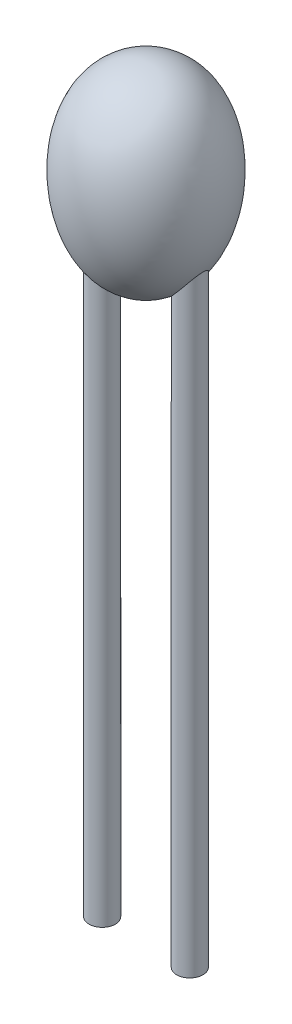
ISO-10303-21;
HEADER;
FILE_DESCRIPTION(('STEP AP214'),'2;1');
FILE_NAME('part.step','',(''),(''),'','','');
FILE_SCHEMA(('AUTOMOTIVE_DESIGN { 1 0 10303 214 1 1 1 1 }'));
ENDSEC;
DATA;
#1=APPLICATION_CONTEXT('core data for automotive mechanical design processes');
#2=APPLICATION_PROTOCOL_DEFINITION('international standard','automotive_design',2000,#1);
#3=PRODUCT_CONTEXT('',#1,'mechanical');
#4=PRODUCT('Part','Part','',(#3));
#5=PRODUCT_RELATED_PRODUCT_CATEGORY('part','',(#4));
#6=PRODUCT_DEFINITION_FORMATION('','',#4);
#7=PRODUCT_DEFINITION_CONTEXT('part definition',#1,'design');
#8=PRODUCT_DEFINITION('design','',#6,#7);
#9=PRODUCT_DEFINITION_SHAPE('','',#8);
#10=(LENGTH_UNIT() NAMED_UNIT(*) SI_UNIT(.MILLI.,.METRE.));
#11=(NAMED_UNIT(*) PLANE_ANGLE_UNIT() SI_UNIT($,.RADIAN.));
#12=(NAMED_UNIT(*) SI_UNIT($,.STERADIAN.) SOLID_ANGLE_UNIT());
#13=UNCERTAINTY_MEASURE_WITH_UNIT(LENGTH_MEASURE(1.E-05),#10,'distance_accuracy_value','');
#14=(GEOMETRIC_REPRESENTATION_CONTEXT(3) GLOBAL_UNCERTAINTY_ASSIGNED_CONTEXT((#13)) GLOBAL_UNIT_ASSIGNED_CONTEXT((#10,
#11,#12)) REPRESENTATION_CONTEXT('',''));
#15=CARTESIAN_POINT('',(0.,0.,0.));
#16=DIRECTION('',(0.,0.,1.));
#17=DIRECTION('',(1.,0.,0.));
#18=AXIS2_PLACEMENT_3D('',#15,#16,#17);
#19=CARTESIAN_POINT('',(0.5,1.,0.));
#20=DIRECTION('',(0.,-1.,0.));
#21=DIRECTION('',(0.,0.,-1.));
#22=AXIS2_PLACEMENT_3D('',#19,#20,#21);
#23=CYLINDRICAL_SURFACE('',#22,0.15);
#24=CARTESIAN_POINT('',(0.5,-6.6,0.));
#25=DIRECTION('',(0.,-1.,0.));
#26=DIRECTION('',(0.,0.,-1.));
#27=AXIS2_PLACEMENT_3D('',#24,#25,#26);
#28=CIRCLE('',#27,0.15);
#29=CARTESIAN_POINT('',(0.5,-6.6,-0.15));
#30=VERTEX_POINT('',#29);
#31=EDGE_CURVE('E68',#30,#30,#28,.T.);
#32=ORIENTED_EDGE('',*,*,#31,.F.);
#33=EDGE_LOOP('',(#32));
#34=FACE_BOUND('',#33,.T.);
#35=CARTESIAN_POINT('',(0.365393323640166,0.,0.0661894453773316));
#36=CARTESIAN_POINT('',(0.36926523841509,0.00368847133227355,0.0740574527203388));
#37=CARTESIAN_POINT('',(0.373685018554712,0.00793246924859814,0.0813156152777789));
#38=CARTESIAN_POINT('',(0.383279870913311,0.0172531358151382,0.0945648684313083));
#39=CARTESIAN_POINT('',(0.388446240455745,0.0223202840086789,0.100568835946845));
#40=CARTESIAN_POINT('',(0.407819434742076,0.0415763209693323,0.119975610300204));
#41=CARTESIAN_POINT('',(0.423463038947674,0.0575753878169098,0.130160110682675));
#42=CARTESIAN_POINT('',(0.450486997997336,0.0862851238791998,0.142121060888072));
#43=CARTESIAN_POINT('',(0.461758176620903,0.0985668055826397,0.145494191096934));
#44=CARTESIAN_POINT('',(0.484201483272414,0.12367604715091,0.149598406796792));
#45=CARTESIAN_POINT('',(0.495373593359753,0.136503703543237,0.150329023115715));
#46=CARTESIAN_POINT('',(0.517641885218623,0.162770729117164,0.149388719263334));
#47=CARTESIAN_POINT('',(0.528726131645177,0.176216985887602,0.147646408019199));
#48=CARTESIAN_POINT('',(0.55026695791732,0.203087471755012,0.141766950962653));
#49=CARTESIAN_POINT('',(0.560723755047158,0.216511706893277,0.137630639531338));
#50=CARTESIAN_POINT('',(0.578882491213666,0.240479365805483,0.127915610005179));
#51=CARTESIAN_POINT('',(0.586729546256081,0.251084043481209,0.122762280163549));
#52=CARTESIAN_POINT('',(0.601693723130269,0.271754172217235,0.110682941903489));
#53=CARTESIAN_POINT('',(0.608812317988833,0.281820690974724,0.103760613922894));
#54=CARTESIAN_POINT('',(0.623143290645203,0.302511297230134,0.0865019114774448));
#55=CARTESIAN_POINT('',(0.630188938483215,0.312967503525629,0.0757967766325557));
#56=CARTESIAN_POINT('',(0.640337984309675,0.328301352460746,0.053931371583487));
#57=CARTESIAN_POINT('',(0.64398993909122,0.333922508102104,0.0436100669202509));
#58=CARTESIAN_POINT('',(0.648427463246691,0.340792875917755,0.0234631094722847));
#59=CARTESIAN_POINT('',(0.649654859267987,0.342713717164162,0.0139912490570897));
#60=CARTESIAN_POINT('',(0.650215876172055,0.343589159047223,-0.00518558057833507));
#61=CARTESIAN_POINT('',(0.649544621451475,0.342536122984136,-0.0148910863754908));
#62=CARTESIAN_POINT('',(0.646276147628818,0.337457598328045,-0.035046951910824));
#63=CARTESIAN_POINT('',(0.64334184403992,0.332912465440968,-0.0452965140036252));
#64=CARTESIAN_POINT('',(0.636977534668197,0.323212469125993,-0.0615989003993041));
#65=CARTESIAN_POINT('',(0.633848403460091,0.318484647811788,-0.06806326221565));
#66=CARTESIAN_POINT('',(0.627026255216163,0.308306489211698,-0.0800732010994178));
#67=CARTESIAN_POINT('',(0.623332211159292,0.302854838419821,-0.0856170656060496));
#68=CARTESIAN_POINT('',(0.612855017495627,0.287601439935468,-0.0994121794655301));
#69=CARTESIAN_POINT('',(0.605693012114478,0.277384004765891,-0.106907153133351));
#70=CARTESIAN_POINT('',(0.590576514515539,0.256335289156745,-0.11998108132498));
#71=CARTESIAN_POINT('',(0.582620162248203,0.245502594836922,-0.125555395945858));
#72=CARTESIAN_POINT('',(0.562836164888219,0.219213135163475,-0.136850310089456));
#73=CARTESIAN_POINT('',(0.550721058516299,0.203620537188869,-0.141758414010689));
#74=CARTESIAN_POINT('',(0.525665471640257,0.172436213068199,-0.148353802456529));
#75=CARTESIAN_POINT('',(0.512725231653445,0.156844487982017,-0.150042021146954));
#76=CARTESIAN_POINT('',(0.488881768656292,0.129027961270737,-0.14996475744217));
#77=CARTESIAN_POINT('',(0.478064201816369,0.116731246387128,-0.148799896937149));
#78=CARTESIAN_POINT('',(0.456398517342646,0.0927074111856814,-0.143954032687809));
#79=CARTESIAN_POINT('',(0.445550445290015,0.0809796903638753,-0.140275746274615));
#80=CARTESIAN_POINT('',(0.420200278800807,0.0542258681521757,-0.128044414389147));
#81=CARTESIAN_POINT('',(0.405823763235899,0.0395756182372258,-0.118195000941729));
#82=CARTESIAN_POINT('',(0.387703577736857,0.0215903132323951,-0.0997251629912121));
#83=CARTESIAN_POINT('',(0.382709568346987,0.0166965746499938,-0.0938385896671014));
#84=CARTESIAN_POINT('',(0.373430347402854,0.00768787731195416,-0.0808962566476636));
#85=CARTESIAN_POINT('',(0.369152736701393,0.00358121033437161,-0.0738293762309442));
#86=CARTESIAN_POINT('',(0.365393323640166,0.,-0.0661894453773321));
#87=B_SPLINE_CURVE_WITH_KNOTS('',3,(#35,#36,#37,#38,#39,#40,#41,#42,#43,#44,#45,#46,#47,#48,#49,
#50,#51,#52,#53,#54,#55,#56,#57,#58,#59,#60,#61,#62,#63,#64,#65,#66,#67,#68,#69,#70,#71,#72,#73,
#74,#75,#76,#77,#78,#79,#80,#81,#82,#83,#84,#85,#86),.UNSPECIFIED.,.F.,.F.,(4,2,2,2,2,2,2,2,2,2,
2,2,2,2,2,2,2,2,2,2,2,2,2,2,2,4),(0.,0.0283883207388168,0.0564690467861137,0.128722929420126,
0.179582898709277,0.230451897622139,0.282819657721981,0.335169177063284,0.377537408227309,
0.419818199024303,0.46885421471376,0.505165617163516,0.533826045396597,0.562560138387911,
0.5966744083189,0.622372678808828,0.648118237145715,0.691549509427375,0.735084978624984,
0.795822537416253,0.856542472105056,0.90560968140538,0.95462392660675,1.02168864636967,
1.04898972877072,1.07656427681643),.UNSPECIFIED.);
#88=CARTESIAN_POINT('',(0.365393323640166,0.,0.0661894453773322));
#89=VERTEX_POINT('',#88);
#90=CARTESIAN_POINT('',(0.365393323640166,0.,-0.0661894453773322));
#91=VERTEX_POINT('',#90);
#92=EDGE_CURVE('E73',#89,#91,#87,.T.);
#93=ORIENTED_EDGE('',*,*,#92,.F.);
#94=CARTESIAN_POINT('',(0.5,0.,0.));
#95=DIRECTION('',(0.,1.,0.));
#96=DIRECTION('',(0.,0.,1.));
#97=AXIS2_PLACEMENT_3D('',#94,#95,#96);
#98=CIRCLE('',#97,0.15);
#99=EDGE_CURVE('E42',#91,#89,#98,.T.);
#100=ORIENTED_EDGE('',*,*,#99,.F.);
#101=EDGE_LOOP('',(#93,#100));
#102=FACE_BOUND('',#101,.T.);
#103=ADVANCED_FACE('F32',(#34,#102),#23,.T.);
#104=CARTESIAN_POINT('',(0.5,-6.6,0.));
#105=DIRECTION('',(0.,-1.,0.));
#106=DIRECTION('',(0.,0.,-1.));
#107=AXIS2_PLACEMENT_3D('',#104,#105,#106);
#108=PLANE('',#107);
#109=ORIENTED_EDGE('',*,*,#31,.T.);
#110=EDGE_LOOP('',(#109));
#111=FACE_BOUND('',#110,.T.);
#112=ADVANCED_FACE('F91',(#111),#108,.T.);
#113=CARTESIAN_POINT('',(0.371339903107875,0.,0.));
#114=CARTESIAN_POINT('',(1.01151578626072,0.45299460718007,0.));
#115=CARTESIAN_POINT('',(0.971685935000548,2.07654942572504,0.));
#116=CARTESIAN_POINT('',(0.,2.0896377816951,0.));
#117=B_SPLINE_CURVE_WITH_KNOTS('',3,(#113,#114,#115,#116),.UNSPECIFIED.,.F.,.F.,(4,4),(0.,1.),.UNSPECIFIED.);
#118=CARTESIAN_POINT('',(0.,2.0896377816951,0.));
#119=DIRECTION('',(0.,1.,0.));
#120=AXIS1_PLACEMENT('',#118,#119);
#121=SURFACE_OF_REVOLUTION('',#117,#120);
#122=CARTESIAN_POINT('',(0.,2.0896377816951,0.));
#123=VERTEX_POINT('',#122);
#124=VERTEX_LOOP('',#123);
#125=FACE_BOUND('',#124,.T.);
#126=CARTESIAN_POINT('',(0.,0.,0.));
#127=DIRECTION('',(0.,1.,0.));
#128=DIRECTION('',(0.,0.,1.));
#129=AXIS2_PLACEMENT_3D('',#126,#127,#128);
#130=CIRCLE('',#129,0.371339903107875);
#131=CARTESIAN_POINT('',(-0.365393323640166,0.,-0.0661894453773331));
#132=VERTEX_POINT('',#131);
#133=EDGE_CURVE('E67',#91,#132,#130,.T.);
#134=ORIENTED_EDGE('',*,*,#133,.T.);
#135=CARTESIAN_POINT('',(-0.365393323640166,0.,-0.0661894453773326));
#136=CARTESIAN_POINT('',(-0.36926523841509,0.00368847133227362,-0.0740574527203397));
#137=CARTESIAN_POINT('',(-0.373685018554712,0.00793246924859828,-0.0813156152777799));
#138=CARTESIAN_POINT('',(-0.383279870913311,0.0172531358151385,-0.0945648684313093));
#139=CARTESIAN_POINT('',(-0.388446240455744,0.0223202840086791,-0.100568835946847));
#140=CARTESIAN_POINT('',(-0.407819434742076,0.0415763209693327,-0.119975610300205));
#141=CARTESIAN_POINT('',(-0.423463038947674,0.0575753878169103,-0.130160110682676));
#142=CARTESIAN_POINT('',(-0.450486997997336,0.0862851238792004,-0.142121060888072));
#143=CARTESIAN_POINT('',(-0.461758176620904,0.0985668055826403,-0.145494191096935));
#144=CARTESIAN_POINT('',(-0.484201483272415,0.123676047150911,-0.149598406796792));
#145=CARTESIAN_POINT('',(-0.495373593359754,0.136503703543238,-0.150329023115716));
#146=CARTESIAN_POINT('',(-0.517641885218624,0.162770729117165,-0.149388719263334));
#147=CARTESIAN_POINT('',(-0.528726131645178,0.176216985887603,-0.147646408019199));
#148=CARTESIAN_POINT('',(-0.550266957917322,0.203087471755013,-0.141766950962653));
#149=CARTESIAN_POINT('',(-0.560723755047159,0.216511706893278,-0.137630639531337));
#150=CARTESIAN_POINT('',(-0.578882491213667,0.240479365805484,-0.127915610005178));
#151=CARTESIAN_POINT('',(-0.586729546256082,0.25108404348121,-0.122762280163548));
#152=CARTESIAN_POINT('',(-0.601693723130269,0.271754172217236,-0.110682941903488));
#153=CARTESIAN_POINT('',(-0.608812317988833,0.281820690974725,-0.103760613922894));
#154=CARTESIAN_POINT('',(-0.623143290645204,0.302511297230135,-0.0865019114774446));
#155=CARTESIAN_POINT('',(-0.630188938483215,0.312967503525629,-0.0757967766325556));
#156=CARTESIAN_POINT('',(-0.640337984309675,0.328301352460746,-0.0539313715834868));
#157=CARTESIAN_POINT('',(-0.643989939091219,0.333922508102103,-0.0436100669202505));
#158=CARTESIAN_POINT('',(-0.64842746324669,0.340792875917754,-0.0234631094722843));
#159=CARTESIAN_POINT('',(-0.649654859267987,0.342713717164161,-0.0139912490570894));
#160=CARTESIAN_POINT('',(-0.650215876172055,0.343589159047223,0.00518558057833546));
#161=CARTESIAN_POINT('',(-0.649544621451475,0.342536122984136,0.0148910863754912));
#162=CARTESIAN_POINT('',(-0.646276147628817,0.337457598328045,0.0350469519108247));
#163=CARTESIAN_POINT('',(-0.643341844039919,0.332912465440967,0.0452965140036261));
#164=CARTESIAN_POINT('',(-0.636977534668197,0.323212469125992,0.0615989003993051));
#165=CARTESIAN_POINT('',(-0.63384840346009,0.318484647811786,0.0680632622156511));
#166=CARTESIAN_POINT('',(-0.627026255216162,0.308306489211697,0.0800732010994191));
#167=CARTESIAN_POINT('',(-0.623332211159291,0.302854838419819,0.085617065606051));
#168=CARTESIAN_POINT('',(-0.612855017495625,0.287601439935466,0.0994121794655316));
#169=CARTESIAN_POINT('',(-0.605693012114476,0.277384004765888,0.106907153133353));
#170=CARTESIAN_POINT('',(-0.590576514515537,0.256335289156742,0.119981081324981));
#171=CARTESIAN_POINT('',(-0.5826201622482,0.245502594836919,0.125555395945859));
#172=CARTESIAN_POINT('',(-0.562836164888216,0.219213135163471,0.136850310089458));
#173=CARTESIAN_POINT('',(-0.550721058516296,0.203620537188865,0.141758414010691));
#174=CARTESIAN_POINT('',(-0.525665471640253,0.172436213068195,0.14835380245653));
#175=CARTESIAN_POINT('',(-0.512725231653442,0.156844487982013,0.150042021146954));
#176=CARTESIAN_POINT('',(-0.488881768656289,0.129027961270733,0.14996475744217));
#177=CARTESIAN_POINT('',(-0.478064201816366,0.116731246387124,0.148799896937149));
#178=CARTESIAN_POINT('',(-0.456398517342643,0.0927074111856782,0.143954032687808));
#179=CARTESIAN_POINT('',(-0.445550445290012,0.0809796903638723,0.140275746274614));
#180=CARTESIAN_POINT('',(-0.420200278800805,0.0542258681521733,0.128044414389146));
#181=CARTESIAN_POINT('',(-0.405823763235896,0.0395756182372237,0.118195000941727));
#182=CARTESIAN_POINT('',(-0.387703577736855,0.0215903132323937,0.099725162991211));
#183=CARTESIAN_POINT('',(-0.382709568346985,0.0166965746499926,0.0938385896671005));
#184=CARTESIAN_POINT('',(-0.373430347402853,0.00768787731195356,0.0808962566476635));
#185=CARTESIAN_POINT('',(-0.369152736701393,0.00358121033437128,0.0738293762309446));
#186=CARTESIAN_POINT('',(-0.365393323640166,0.,0.0661894453773331));
#187=B_SPLINE_CURVE_WITH_KNOTS('',3,(#135,#136,#137,#138,#139,#140,#141,#142,#143,#144,#145,
#146,#147,#148,#149,#150,#151,#152,#153,#154,#155,#156,#157,#158,#159,#160,#161,#162,#163,#164,
#165,#166,#167,#168,#169,#170,#171,#172,#173,#174,#175,#176,#177,#178,#179,#180,#181,#182,#183,
#184,#185,#186),.UNSPECIFIED.,.F.,.F.,(4,2,2,2,2,2,2,2,2,2,2,2,2,2,2,2,2,2,2,2,2,2,2,2,2,4),(0.,
0.028388320738817,0.0564690467861139,0.128722929420127,0.179582898709278,0.23045189762214,
0.282819657721982,0.335169177063286,0.377537408227311,0.419818199024304,0.46885421471376,
0.505165617163516,0.533826045396597,0.562560138387911,0.596674408318901,0.62237267880883,
0.648118237145718,0.691549509427378,0.735084978624988,0.795822537416258,0.856542472105061,
0.905609681405384,0.954623926606753,1.02168864636967,1.04898972877072,1.07656427681643),.UNSPECIFIED.);
#188=CARTESIAN_POINT('',(-0.365393323640166,0.,0.0661894453773329));
#189=VERTEX_POINT('',#188);
#190=EDGE_CURVE('E48',#132,#189,#187,.T.);
#191=ORIENTED_EDGE('',*,*,#190,.T.);
#192=EDGE_CURVE('E54',#189,#89,#130,.T.);
#193=ORIENTED_EDGE('',*,*,#192,.T.);
#194=ORIENTED_EDGE('',*,*,#92,.T.);
#195=EDGE_LOOP('',(#134,#191,#193,#194));
#196=FACE_BOUND('',#195,.T.);
#197=ADVANCED_FACE('F34',(#125,#196),#121,.T.);
#198=CARTESIAN_POINT('',(0.,0.,0.));
#199=DIRECTION('',(0.,1.,0.));
#200=DIRECTION('',(0.,0.,1.));
#201=AXIS2_PLACEMENT_3D('',#198,#199,#200);
#202=PLANE('',#201);
#203=ORIENTED_EDGE('',*,*,#192,.F.);
#204=CARTESIAN_POINT('',(-0.5,0.,0.));
#205=DIRECTION('',(0.,1.,0.));
#206=DIRECTION('',(0.,0.,1.));
#207=AXIS2_PLACEMENT_3D('',#204,#205,#206);
#208=CIRCLE('',#207,0.15);
#209=EDGE_CURVE('E11',#189,#132,#208,.T.);
#210=ORIENTED_EDGE('',*,*,#209,.T.);
#211=ORIENTED_EDGE('',*,*,#133,.F.);
#212=ORIENTED_EDGE('',*,*,#99,.T.);
#213=EDGE_LOOP('',(#203,#210,#211,#212));
#214=FACE_BOUND('',#213,.T.);
#215=ADVANCED_FACE('F72',(#214),#202,.F.);
#216=CARTESIAN_POINT('',(-0.5,1.,0.));
#217=DIRECTION('',(0.,-1.,0.));
#218=DIRECTION('',(0.,0.,-1.));
#219=AXIS2_PLACEMENT_3D('',#216,#217,#218);
#220=CYLINDRICAL_SURFACE('',#219,0.15);
#221=CARTESIAN_POINT('',(-0.5,-6.6,0.));
#222=DIRECTION('',(0.,-1.,0.));
#223=DIRECTION('',(0.,0.,1.));
#224=AXIS2_PLACEMENT_3D('',#221,#222,#223);
#225=CIRCLE('',#224,0.15);
#226=CARTESIAN_POINT('',(-0.5,-6.6,0.15));
#227=VERTEX_POINT('',#226);
#228=EDGE_CURVE('E69',#227,#227,#225,.T.);
#229=ORIENTED_EDGE('',*,*,#228,.F.);
#230=EDGE_LOOP('',(#229));
#231=FACE_BOUND('',#230,.T.);
#232=ORIENTED_EDGE('',*,*,#190,.F.);
#233=ORIENTED_EDGE('',*,*,#209,.F.);
#234=EDGE_LOOP('',(#232,#233));
#235=FACE_BOUND('',#234,.T.);
#236=ADVANCED_FACE('F63',(#231,#235),#220,.T.);
#237=CARTESIAN_POINT('',(-0.5,-6.6,0.));
#238=DIRECTION('',(0.,1.,0.));
#239=DIRECTION('',(0.,0.,1.));
#240=AXIS2_PLACEMENT_3D('',#237,#238,#239);
#241=PLANE('',#240);
#242=ORIENTED_EDGE('',*,*,#228,.T.);
#243=EDGE_LOOP('',(#242));
#244=FACE_BOUND('',#243,.T.);
#245=ADVANCED_FACE('F99',(#244),#241,.F.);
#246=CLOSED_SHELL('',(#103,#112,#197,#215,#236,#245));
#247=MANIFOLD_SOLID_BREP('B2',#246);
#248=ADVANCED_BREP_SHAPE_REPRESENTATION('',(#18,#247),#14);
#249=SHAPE_DEFINITION_REPRESENTATION(#9,#248);
ENDSEC;
END-ISO-10303-21;
